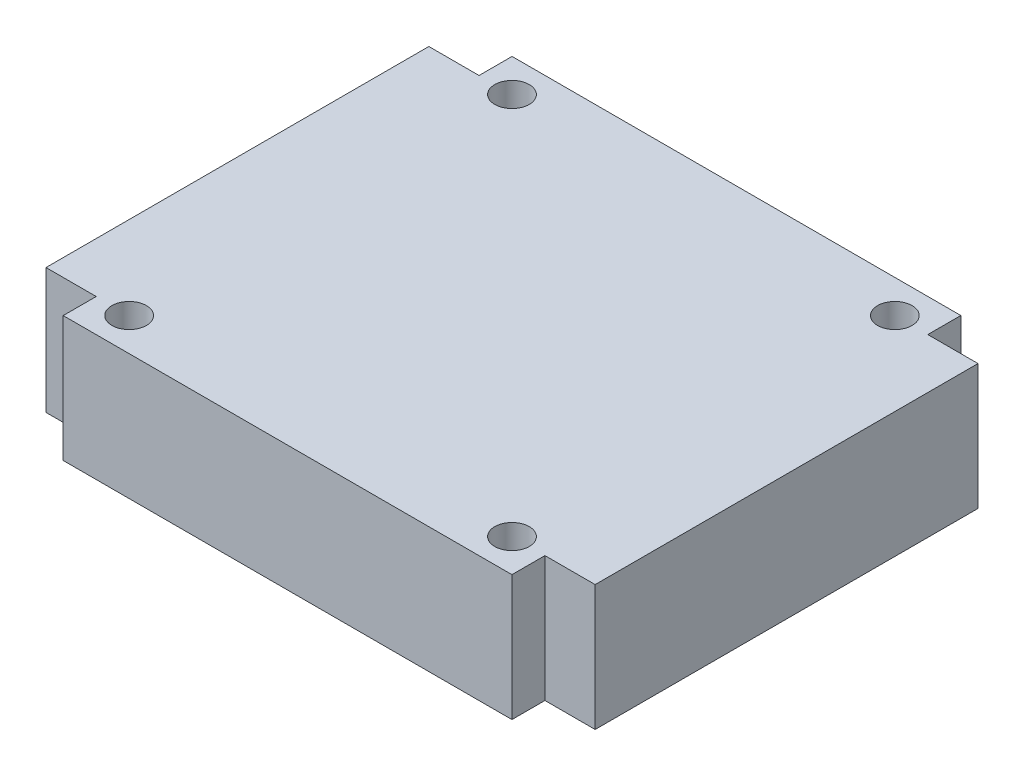
ISO-10303-21;
HEADER;
FILE_DESCRIPTION(('STEP AP214'),'2;1');
FILE_NAME('part.step','',(''),(''),'','','');
FILE_SCHEMA(('AUTOMOTIVE_DESIGN { 1 0 10303 214 1 1 1 1 }'));
ENDSEC;
DATA;
#1=APPLICATION_CONTEXT('core data for automotive mechanical design processes');
#2=APPLICATION_PROTOCOL_DEFINITION('international standard','automotive_design',2000,#1);
#3=PRODUCT_CONTEXT('',#1,'mechanical');
#4=PRODUCT('Part','Part','',(#3));
#5=PRODUCT_RELATED_PRODUCT_CATEGORY('part','',(#4));
#6=PRODUCT_DEFINITION_FORMATION('','',#4);
#7=PRODUCT_DEFINITION_CONTEXT('part definition',#1,'design');
#8=PRODUCT_DEFINITION('design','',#6,#7);
#9=PRODUCT_DEFINITION_SHAPE('','',#8);
#10=(LENGTH_UNIT() NAMED_UNIT(*) SI_UNIT(.MILLI.,.METRE.));
#11=(NAMED_UNIT(*) PLANE_ANGLE_UNIT() SI_UNIT($,.RADIAN.));
#12=(NAMED_UNIT(*) SI_UNIT($,.STERADIAN.) SOLID_ANGLE_UNIT());
#13=UNCERTAINTY_MEASURE_WITH_UNIT(LENGTH_MEASURE(1.E-05),#10,'distance_accuracy_value','');
#14=(GEOMETRIC_REPRESENTATION_CONTEXT(3) GLOBAL_UNCERTAINTY_ASSIGNED_CONTEXT((#13)) GLOBAL_UNIT_ASSIGNED_CONTEXT((#10,
#11,#12)) REPRESENTATION_CONTEXT('',''));
#15=CARTESIAN_POINT('',(0.,0.,0.));
#16=DIRECTION('',(0.,0.,1.));
#17=DIRECTION('',(1.,0.,0.));
#18=AXIS2_PLACEMENT_3D('',#15,#16,#17);
#19=CARTESIAN_POINT('',(21.875,10.,-15.25));
#20=DIRECTION('',(-1.,0.,0.));
#21=DIRECTION('',(0.,0.,1.));
#22=AXIS2_PLACEMENT_3D('',#19,#20,#21);
#23=PLANE('',#22);
#24=DIRECTION('',(0.,0.,-1.));
#25=VECTOR('',#24,1.);
#26=CARTESIAN_POINT('',(21.875,0.,-15.25));
#27=LINE('',#26,#25);
#28=CARTESIAN_POINT('',(21.875,0.,15.25));
#29=VERTEX_POINT('',#28);
#30=CARTESIAN_POINT('',(21.875,0.,-15.25));
#31=VERTEX_POINT('',#30);
#32=EDGE_CURVE('E165',#29,#31,#27,.T.);
#33=ORIENTED_EDGE('',*,*,#32,.T.);
#34=DIRECTION('',(0.,-1.,0.));
#35=VECTOR('',#34,1.);
#36=CARTESIAN_POINT('',(21.875,10.,-15.25));
#37=LINE('',#36,#35);
#38=CARTESIAN_POINT('',(21.875,10.,-15.25));
#39=VERTEX_POINT('',#38);
#40=EDGE_CURVE('E11',#39,#31,#37,.T.);
#41=ORIENTED_EDGE('',*,*,#40,.F.);
#42=DIRECTION('',(0.,0.,-1.));
#43=VECTOR('',#42,1.);
#44=CARTESIAN_POINT('',(21.875,10.,-15.25));
#45=LINE('',#44,#43);
#46=CARTESIAN_POINT('',(21.875,10.,15.25));
#47=VERTEX_POINT('',#46);
#48=EDGE_CURVE('E187',#47,#39,#45,.T.);
#49=ORIENTED_EDGE('',*,*,#48,.F.);
#50=DIRECTION('',(0.,-1.,0.));
#51=VECTOR('',#50,1.);
#52=CARTESIAN_POINT('',(21.875,10.,15.25));
#53=LINE('',#52,#51);
#54=EDGE_CURVE('E161',#47,#29,#53,.T.);
#55=ORIENTED_EDGE('',*,*,#54,.T.);
#56=EDGE_LOOP('',(#33,#41,#49,#55));
#57=FACE_BOUND('',#56,.T.);
#58=ADVANCED_FACE('F43',(#57),#23,.F.);
#59=CARTESIAN_POINT('',(17.875,10.,-15.25));
#60=DIRECTION('',(0.,0.,1.));
#61=DIRECTION('',(1.,0.,0.));
#62=AXIS2_PLACEMENT_3D('',#59,#60,#61);
#63=PLANE('',#62);
#64=DIRECTION('',(-1.,0.,0.));
#65=VECTOR('',#64,1.);
#66=CARTESIAN_POINT('',(17.875,0.,-15.25));
#67=LINE('',#66,#65);
#68=CARTESIAN_POINT('',(17.875,0.,-15.25));
#69=VERTEX_POINT('',#68);
#70=EDGE_CURVE('E168',#31,#69,#67,.T.);
#71=ORIENTED_EDGE('',*,*,#70,.T.);
#72=DIRECTION('',(0.,-1.,0.));
#73=VECTOR('',#72,1.);
#74=CARTESIAN_POINT('',(17.875,10.,-15.25));
#75=LINE('',#74,#73);
#76=CARTESIAN_POINT('',(17.875,10.,-15.25));
#77=VERTEX_POINT('',#76);
#78=EDGE_CURVE('E52',#77,#69,#75,.T.);
#79=ORIENTED_EDGE('',*,*,#78,.F.);
#80=DIRECTION('',(-1.,0.,0.));
#81=VECTOR('',#80,1.);
#82=CARTESIAN_POINT('',(17.875,10.,-15.25));
#83=LINE('',#82,#81);
#84=EDGE_CURVE('E116',#39,#77,#83,.T.);
#85=ORIENTED_EDGE('',*,*,#84,.F.);
#86=ORIENTED_EDGE('',*,*,#40,.T.);
#87=EDGE_LOOP('',(#71,#79,#85,#86));
#88=FACE_BOUND('',#87,.T.);
#89=ADVANCED_FACE('F252',(#88),#63,.F.);
#90=CARTESIAN_POINT('',(17.875,10.,-15.25));
#91=DIRECTION('',(-1.,0.,0.));
#92=DIRECTION('',(0.,0.,1.));
#93=AXIS2_PLACEMENT_3D('',#90,#91,#92);
#94=PLANE('',#93);
#95=DIRECTION('',(0.,0.,-1.));
#96=VECTOR('',#95,1.);
#97=CARTESIAN_POINT('',(17.875,0.,-15.25));
#98=LINE('',#97,#96);
#99=CARTESIAN_POINT('',(17.875,0.,-17.88));
#100=VERTEX_POINT('',#99);
#101=EDGE_CURVE('E170',#69,#100,#98,.T.);
#102=ORIENTED_EDGE('',*,*,#101,.T.);
#103=DIRECTION('',(0.,-1.,0.));
#104=VECTOR('',#103,1.);
#105=CARTESIAN_POINT('',(17.875,10.,-17.88));
#106=LINE('',#105,#104);
#107=CARTESIAN_POINT('',(17.875,10.,-17.88));
#108=VERTEX_POINT('',#107);
#109=EDGE_CURVE('E206',#108,#100,#106,.T.);
#110=ORIENTED_EDGE('',*,*,#109,.F.);
#111=DIRECTION('',(0.,0.,-1.));
#112=VECTOR('',#111,1.);
#113=CARTESIAN_POINT('',(17.875,10.,-15.25));
#114=LINE('',#113,#112);
#115=EDGE_CURVE('E369',#77,#108,#114,.T.);
#116=ORIENTED_EDGE('',*,*,#115,.F.);
#117=ORIENTED_EDGE('',*,*,#78,.T.);
#118=EDGE_LOOP('',(#102,#110,#116,#117));
#119=FACE_BOUND('',#118,.T.);
#120=ADVANCED_FACE('F256',(#119),#94,.F.);
#121=CARTESIAN_POINT('',(-17.875,10.,-17.88));
#122=DIRECTION('',(0.,0.,1.));
#123=DIRECTION('',(1.,0.,0.));
#124=AXIS2_PLACEMENT_3D('',#121,#122,#123);
#125=PLANE('',#124);
#126=DIRECTION('',(-1.,0.,0.));
#127=VECTOR('',#126,1.);
#128=CARTESIAN_POINT('',(-17.875,0.,-17.88));
#129=LINE('',#128,#127);
#130=CARTESIAN_POINT('',(-17.875,0.,-17.88));
#131=VERTEX_POINT('',#130);
#132=EDGE_CURVE('E172',#100,#131,#129,.T.);
#133=ORIENTED_EDGE('',*,*,#132,.T.);
#134=DIRECTION('',(0.,-1.,0.));
#135=VECTOR('',#134,1.);
#136=CARTESIAN_POINT('',(-17.875,10.,-17.88));
#137=LINE('',#136,#135);
#138=CARTESIAN_POINT('',(-17.875,10.,-17.88));
#139=VERTEX_POINT('',#138);
#140=EDGE_CURVE('E203',#139,#131,#137,.T.);
#141=ORIENTED_EDGE('',*,*,#140,.F.);
#142=DIRECTION('',(-1.,0.,0.));
#143=VECTOR('',#142,1.);
#144=CARTESIAN_POINT('',(-17.875,10.,-17.88));
#145=LINE('',#144,#143);
#146=EDGE_CURVE('E371',#108,#139,#145,.T.);
#147=ORIENTED_EDGE('',*,*,#146,.F.);
#148=ORIENTED_EDGE('',*,*,#109,.T.);
#149=EDGE_LOOP('',(#133,#141,#147,#148));
#150=FACE_BOUND('',#149,.T.);
#151=ADVANCED_FACE('F260',(#150),#125,.F.);
#152=CARTESIAN_POINT('',(-17.875,10.,-15.25));
#153=DIRECTION('',(1.,0.,0.));
#154=DIRECTION('',(0.,0.,-1.));
#155=AXIS2_PLACEMENT_3D('',#152,#153,#154);
#156=PLANE('',#155);
#157=DIRECTION('',(0.,0.,1.));
#158=VECTOR('',#157,1.);
#159=CARTESIAN_POINT('',(-17.875,0.,-15.25));
#160=LINE('',#159,#158);
#161=CARTESIAN_POINT('',(-17.875,0.,-15.25));
#162=VERTEX_POINT('',#161);
#163=EDGE_CURVE('E174',#131,#162,#160,.T.);
#164=ORIENTED_EDGE('',*,*,#163,.T.);
#165=DIRECTION('',(0.,-1.,0.));
#166=VECTOR('',#165,1.);
#167=CARTESIAN_POINT('',(-17.875,10.,-15.25));
#168=LINE('',#167,#166);
#169=CARTESIAN_POINT('',(-17.875,10.,-15.25));
#170=VERTEX_POINT('',#169);
#171=EDGE_CURVE('E200',#170,#162,#168,.T.);
#172=ORIENTED_EDGE('',*,*,#171,.F.);
#173=DIRECTION('',(0.,0.,1.));
#174=VECTOR('',#173,1.);
#175=CARTESIAN_POINT('',(-17.875,10.,-15.25));
#176=LINE('',#175,#174);
#177=EDGE_CURVE('E373',#139,#170,#176,.T.);
#178=ORIENTED_EDGE('',*,*,#177,.F.);
#179=ORIENTED_EDGE('',*,*,#140,.T.);
#180=EDGE_LOOP('',(#164,#172,#178,#179));
#181=FACE_BOUND('',#180,.T.);
#182=ADVANCED_FACE('F266',(#181),#156,.F.);
#183=CARTESIAN_POINT('',(-17.875,10.,-15.25));
#184=DIRECTION('',(0.,0.,1.));
#185=DIRECTION('',(1.,0.,0.));
#186=AXIS2_PLACEMENT_3D('',#183,#184,#185);
#187=PLANE('',#186);
#188=DIRECTION('',(-1.,0.,0.));
#189=VECTOR('',#188,1.);
#190=CARTESIAN_POINT('',(-17.875,0.,-15.25));
#191=LINE('',#190,#189);
#192=CARTESIAN_POINT('',(-21.875,0.,-15.25));
#193=VERTEX_POINT('',#192);
#194=EDGE_CURVE('E176',#162,#193,#191,.T.);
#195=ORIENTED_EDGE('',*,*,#194,.T.);
#196=DIRECTION('',(0.,-1.,0.));
#197=VECTOR('',#196,1.);
#198=CARTESIAN_POINT('',(-21.875,10.,-15.25));
#199=LINE('',#198,#197);
#200=CARTESIAN_POINT('',(-21.875,10.,-15.25));
#201=VERTEX_POINT('',#200);
#202=EDGE_CURVE('E197',#201,#193,#199,.T.);
#203=ORIENTED_EDGE('',*,*,#202,.F.);
#204=DIRECTION('',(-1.,0.,0.));
#205=VECTOR('',#204,1.);
#206=CARTESIAN_POINT('',(-17.875,10.,-15.25));
#207=LINE('',#206,#205);
#208=EDGE_CURVE('E375',#170,#201,#207,.T.);
#209=ORIENTED_EDGE('',*,*,#208,.F.);
#210=ORIENTED_EDGE('',*,*,#171,.T.);
#211=EDGE_LOOP('',(#195,#203,#209,#210));
#212=FACE_BOUND('',#211,.T.);
#213=ADVANCED_FACE('F270',(#212),#187,.F.);
#214=CARTESIAN_POINT('',(-21.875,10.,-15.25));
#215=DIRECTION('',(1.,0.,0.));
#216=DIRECTION('',(0.,0.,-1.));
#217=AXIS2_PLACEMENT_3D('',#214,#215,#216);
#218=PLANE('',#217);
#219=DIRECTION('',(0.,0.,1.));
#220=VECTOR('',#219,1.);
#221=CARTESIAN_POINT('',(-21.875,0.,-15.25));
#222=LINE('',#221,#220);
#223=CARTESIAN_POINT('',(-21.875,0.,15.25));
#224=VERTEX_POINT('',#223);
#225=EDGE_CURVE('E178',#193,#224,#222,.T.);
#226=ORIENTED_EDGE('',*,*,#225,.T.);
#227=DIRECTION('',(0.,-1.,0.));
#228=VECTOR('',#227,1.);
#229=CARTESIAN_POINT('',(-21.875,10.,15.25));
#230=LINE('',#229,#228);
#231=CARTESIAN_POINT('',(-21.875,10.,15.25));
#232=VERTEX_POINT('',#231);
#233=EDGE_CURVE('E194',#232,#224,#230,.T.);
#234=ORIENTED_EDGE('',*,*,#233,.F.);
#235=DIRECTION('',(0.,0.,1.));
#236=VECTOR('',#235,1.);
#237=CARTESIAN_POINT('',(-21.875,10.,-15.25));
#238=LINE('',#237,#236);
#239=EDGE_CURVE('E377',#201,#232,#238,.T.);
#240=ORIENTED_EDGE('',*,*,#239,.F.);
#241=ORIENTED_EDGE('',*,*,#202,.T.);
#242=EDGE_LOOP('',(#226,#234,#240,#241));
#243=FACE_BOUND('',#242,.T.);
#244=ADVANCED_FACE('F274',(#243),#218,.F.);
#245=CARTESIAN_POINT('',(-17.875,10.,15.25));
#246=DIRECTION('',(0.,0.,-1.));
#247=DIRECTION('',(-1.,0.,0.));
#248=AXIS2_PLACEMENT_3D('',#245,#246,#247);
#249=PLANE('',#248);
#250=DIRECTION('',(1.,0.,0.));
#251=VECTOR('',#250,1.);
#252=CARTESIAN_POINT('',(-17.875,0.,15.25));
#253=LINE('',#252,#251);
#254=CARTESIAN_POINT('',(-17.875,0.,15.25));
#255=VERTEX_POINT('',#254);
#256=EDGE_CURVE('E180',#224,#255,#253,.T.);
#257=ORIENTED_EDGE('',*,*,#256,.T.);
#258=DIRECTION('',(0.,-1.,0.));
#259=VECTOR('',#258,1.);
#260=CARTESIAN_POINT('',(-17.875,10.,15.25));
#261=LINE('',#260,#259);
#262=CARTESIAN_POINT('',(-17.875,10.,15.25));
#263=VERTEX_POINT('',#262);
#264=EDGE_CURVE('E191',#263,#255,#261,.T.);
#265=ORIENTED_EDGE('',*,*,#264,.F.);
#266=DIRECTION('',(1.,0.,0.));
#267=VECTOR('',#266,1.);
#268=CARTESIAN_POINT('',(-17.875,10.,15.25));
#269=LINE('',#268,#267);
#270=EDGE_CURVE('E379',#232,#263,#269,.T.);
#271=ORIENTED_EDGE('',*,*,#270,.F.);
#272=ORIENTED_EDGE('',*,*,#233,.T.);
#273=EDGE_LOOP('',(#257,#265,#271,#272));
#274=FACE_BOUND('',#273,.T.);
#275=ADVANCED_FACE('F278',(#274),#249,.F.);
#276=CARTESIAN_POINT('',(-17.875,10.,17.88));
#277=DIRECTION('',(1.,0.,0.));
#278=DIRECTION('',(0.,0.,-1.));
#279=AXIS2_PLACEMENT_3D('',#276,#277,#278);
#280=PLANE('',#279);
#281=DIRECTION('',(0.,0.,1.));
#282=VECTOR('',#281,1.);
#283=CARTESIAN_POINT('',(-17.875,0.,17.88));
#284=LINE('',#283,#282);
#285=CARTESIAN_POINT('',(-17.875,0.,17.88));
#286=VERTEX_POINT('',#285);
#287=EDGE_CURVE('E182',#255,#286,#284,.T.);
#288=ORIENTED_EDGE('',*,*,#287,.T.);
#289=DIRECTION('',(0.,-1.,0.));
#290=VECTOR('',#289,1.);
#291=CARTESIAN_POINT('',(-17.875,10.,17.88));
#292=LINE('',#291,#290);
#293=CARTESIAN_POINT('',(-17.875,10.,17.88));
#294=VERTEX_POINT('',#293);
#295=EDGE_CURVE('E156',#294,#286,#292,.T.);
#296=ORIENTED_EDGE('',*,*,#295,.F.);
#297=DIRECTION('',(0.,0.,1.));
#298=VECTOR('',#297,1.);
#299=CARTESIAN_POINT('',(-17.875,10.,17.88));
#300=LINE('',#299,#298);
#301=EDGE_CURVE('E147',#263,#294,#300,.T.);
#302=ORIENTED_EDGE('',*,*,#301,.F.);
#303=ORIENTED_EDGE('',*,*,#264,.T.);
#304=EDGE_LOOP('',(#288,#296,#302,#303));
#305=FACE_BOUND('',#304,.T.);
#306=ADVANCED_FACE('F282',(#305),#280,.F.);
#307=CARTESIAN_POINT('',(-17.875,10.,17.88));
#308=DIRECTION('',(0.,0.,-1.));
#309=DIRECTION('',(-1.,0.,0.));
#310=AXIS2_PLACEMENT_3D('',#307,#308,#309);
#311=PLANE('',#310);
#312=DIRECTION('',(1.,0.,0.));
#313=VECTOR('',#312,1.);
#314=CARTESIAN_POINT('',(-17.875,0.,17.88));
#315=LINE('',#314,#313);
#316=CARTESIAN_POINT('',(17.875,0.,17.88));
#317=VERTEX_POINT('',#316);
#318=EDGE_CURVE('E155',#286,#317,#315,.T.);
#319=ORIENTED_EDGE('',*,*,#318,.T.);
#320=DIRECTION('',(0.,-1.,0.));
#321=VECTOR('',#320,1.);
#322=CARTESIAN_POINT('',(17.875,10.,17.88));
#323=LINE('',#322,#321);
#324=CARTESIAN_POINT('',(17.875,10.,17.88));
#325=VERTEX_POINT('',#324);
#326=EDGE_CURVE('E152',#325,#317,#323,.T.);
#327=ORIENTED_EDGE('',*,*,#326,.F.);
#328=DIRECTION('',(1.,0.,0.));
#329=VECTOR('',#328,1.);
#330=CARTESIAN_POINT('',(-17.875,10.,17.88));
#331=LINE('',#330,#329);
#332=EDGE_CURVE('E141',#294,#325,#331,.T.);
#333=ORIENTED_EDGE('',*,*,#332,.F.);
#334=ORIENTED_EDGE('',*,*,#295,.T.);
#335=EDGE_LOOP('',(#319,#327,#333,#334));
#336=FACE_BOUND('',#335,.T.);
#337=ADVANCED_FACE('F153',(#336),#311,.F.);
#338=CARTESIAN_POINT('',(17.875,10.,17.88));
#339=DIRECTION('',(-1.,0.,0.));
#340=DIRECTION('',(0.,0.,1.));
#341=AXIS2_PLACEMENT_3D('',#338,#339,#340);
#342=PLANE('',#341);
#343=DIRECTION('',(0.,0.,-1.));
#344=VECTOR('',#343,1.);
#345=CARTESIAN_POINT('',(17.875,0.,17.88));
#346=LINE('',#345,#344);
#347=CARTESIAN_POINT('',(17.875,0.,15.25));
#348=VERTEX_POINT('',#347);
#349=EDGE_CURVE('E102',#317,#348,#346,.T.);
#350=ORIENTED_EDGE('',*,*,#349,.T.);
#351=DIRECTION('',(0.,-1.,0.));
#352=VECTOR('',#351,1.);
#353=CARTESIAN_POINT('',(17.875,10.,15.25));
#354=LINE('',#353,#352);
#355=CARTESIAN_POINT('',(17.875,10.,15.25));
#356=VERTEX_POINT('',#355);
#357=EDGE_CURVE('E157',#356,#348,#354,.T.);
#358=ORIENTED_EDGE('',*,*,#357,.F.);
#359=DIRECTION('',(0.,0.,-1.));
#360=VECTOR('',#359,1.);
#361=CARTESIAN_POINT('',(17.875,10.,17.88));
#362=LINE('',#361,#360);
#363=EDGE_CURVE('E145',#325,#356,#362,.T.);
#364=ORIENTED_EDGE('',*,*,#363,.F.);
#365=ORIENTED_EDGE('',*,*,#326,.T.);
#366=EDGE_LOOP('',(#350,#358,#364,#365));
#367=FACE_BOUND('',#366,.T.);
#368=ADVANCED_FACE('F159',(#367),#342,.F.);
#369=CARTESIAN_POINT('',(17.875,10.,15.25));
#370=DIRECTION('',(0.,0.,-1.));
#371=DIRECTION('',(-1.,0.,0.));
#372=AXIS2_PLACEMENT_3D('',#369,#370,#371);
#373=PLANE('',#372);
#374=DIRECTION('',(1.,0.,0.));
#375=VECTOR('',#374,1.);
#376=CARTESIAN_POINT('',(17.875,0.,15.25));
#377=LINE('',#376,#375);
#378=EDGE_CURVE('E108',#348,#29,#377,.T.);
#379=ORIENTED_EDGE('',*,*,#378,.T.);
#380=ORIENTED_EDGE('',*,*,#54,.F.);
#381=DIRECTION('',(1.,0.,0.));
#382=VECTOR('',#381,1.);
#383=CARTESIAN_POINT('',(17.875,10.,15.25));
#384=LINE('',#383,#382);
#385=EDGE_CURVE('E61',#356,#47,#384,.T.);
#386=ORIENTED_EDGE('',*,*,#385,.F.);
#387=ORIENTED_EDGE('',*,*,#357,.T.);
#388=EDGE_LOOP('',(#379,#380,#386,#387));
#389=FACE_BOUND('',#388,.T.);
#390=ADVANCED_FACE('F241',(#389),#373,.F.);
#391=CARTESIAN_POINT('',(0.,10.,0.));
#392=DIRECTION('',(0.,1.,0.));
#393=DIRECTION('',(0.,0.,1.));
#394=AXIS2_PLACEMENT_3D('',#391,#392,#393);
#395=PLANE('',#394);
#396=CARTESIAN_POINT('',(-15.25,10.,15.25));
#397=DIRECTION('',(0.,1.,0.));
#398=DIRECTION('',(0.,0.,1.));
#399=AXIS2_PLACEMENT_3D('',#396,#397,#398);
#400=CIRCLE('',#399,1.375);
#401=CARTESIAN_POINT('',(-15.25,10.,16.625));
#402=VERTEX_POINT('',#401);
#403=EDGE_CURVE('E357',#402,#402,#400,.T.);
#404=ORIENTED_EDGE('',*,*,#403,.F.);
#405=EDGE_LOOP('',(#404));
#406=FACE_BOUND('',#405,.T.);
#407=CARTESIAN_POINT('',(15.25,10.,15.25));
#408=DIRECTION('',(0.,1.,0.));
#409=DIRECTION('',(0.,0.,1.));
#410=AXIS2_PLACEMENT_3D('',#407,#408,#409);
#411=CIRCLE('',#410,1.375);
#412=CARTESIAN_POINT('',(15.25,10.,16.625));
#413=VERTEX_POINT('',#412);
#414=EDGE_CURVE('E358',#413,#413,#411,.T.);
#415=ORIENTED_EDGE('',*,*,#414,.F.);
#416=EDGE_LOOP('',(#415));
#417=FACE_BOUND('',#416,.T.);
#418=CARTESIAN_POINT('',(15.25,10.,-15.25));
#419=DIRECTION('',(0.,1.,0.));
#420=DIRECTION('',(0.,0.,1.));
#421=AXIS2_PLACEMENT_3D('',#418,#419,#420);
#422=CIRCLE('',#421,1.375);
#423=CARTESIAN_POINT('',(15.25,10.,-13.875));
#424=VERTEX_POINT('',#423);
#425=EDGE_CURVE('E361',#424,#424,#422,.T.);
#426=ORIENTED_EDGE('',*,*,#425,.F.);
#427=EDGE_LOOP('',(#426));
#428=FACE_BOUND('',#427,.T.);
#429=CARTESIAN_POINT('',(-15.25,10.,-15.25));
#430=DIRECTION('',(0.,1.,0.));
#431=DIRECTION('',(0.,0.,1.));
#432=AXIS2_PLACEMENT_3D('',#429,#430,#431);
#433=CIRCLE('',#432,1.375);
#434=CARTESIAN_POINT('',(-15.25,10.,-13.875));
#435=VERTEX_POINT('',#434);
#436=EDGE_CURVE('E215',#435,#435,#433,.T.);
#437=ORIENTED_EDGE('',*,*,#436,.F.);
#438=EDGE_LOOP('',(#437));
#439=FACE_BOUND('',#438,.T.);
#440=ORIENTED_EDGE('',*,*,#48,.T.);
#441=ORIENTED_EDGE('',*,*,#84,.T.);
#442=ORIENTED_EDGE('',*,*,#115,.T.);
#443=ORIENTED_EDGE('',*,*,#146,.T.);
#444=ORIENTED_EDGE('',*,*,#177,.T.);
#445=ORIENTED_EDGE('',*,*,#208,.T.);
#446=ORIENTED_EDGE('',*,*,#239,.T.);
#447=ORIENTED_EDGE('',*,*,#270,.T.);
#448=ORIENTED_EDGE('',*,*,#301,.T.);
#449=ORIENTED_EDGE('',*,*,#332,.T.);
#450=ORIENTED_EDGE('',*,*,#363,.T.);
#451=ORIENTED_EDGE('',*,*,#385,.T.);
#452=EDGE_LOOP('',(#440,#441,#442,#443,#444,#445,#446,#447,#448,#449,#450,#451));
#453=FACE_BOUND('',#452,.T.);
#454=ADVANCED_FACE('F143',(#406,#417,#428,#439,#453),#395,.T.);
#455=CARTESIAN_POINT('',(0.,0.,0.));
#456=DIRECTION('',(0.,1.,0.));
#457=DIRECTION('',(0.,0.,1.));
#458=AXIS2_PLACEMENT_3D('',#455,#456,#457);
#459=PLANE('',#458);
#460=CARTESIAN_POINT('',(-15.25,0.,15.25));
#461=DIRECTION('',(0.,1.,0.));
#462=DIRECTION('',(0.,0.,1.));
#463=AXIS2_PLACEMENT_3D('',#460,#461,#462);
#464=CIRCLE('',#463,1.375);
#465=CARTESIAN_POINT('',(-15.25,0.,16.625));
#466=VERTEX_POINT('',#465);
#467=EDGE_CURVE('E46',#466,#466,#464,.F.);
#468=ORIENTED_EDGE('',*,*,#467,.F.);
#469=EDGE_LOOP('',(#468));
#470=FACE_BOUND('',#469,.T.);
#471=CARTESIAN_POINT('',(15.25,0.,15.25));
#472=DIRECTION('',(0.,1.,0.));
#473=DIRECTION('',(0.,0.,1.));
#474=AXIS2_PLACEMENT_3D('',#471,#472,#473);
#475=CIRCLE('',#474,1.375);
#476=CARTESIAN_POINT('',(15.25,0.,16.625));
#477=VERTEX_POINT('',#476);
#478=EDGE_CURVE('E217',#477,#477,#475,.F.);
#479=ORIENTED_EDGE('',*,*,#478,.F.);
#480=EDGE_LOOP('',(#479));
#481=FACE_BOUND('',#480,.T.);
#482=CARTESIAN_POINT('',(15.25,0.,-15.25));
#483=DIRECTION('',(0.,1.,0.));
#484=DIRECTION('',(0.,0.,1.));
#485=AXIS2_PLACEMENT_3D('',#482,#483,#484);
#486=CIRCLE('',#485,1.375);
#487=CARTESIAN_POINT('',(15.25,0.,-13.875));
#488=VERTEX_POINT('',#487);
#489=EDGE_CURVE('E214',#488,#488,#486,.F.);
#490=ORIENTED_EDGE('',*,*,#489,.F.);
#491=EDGE_LOOP('',(#490));
#492=FACE_BOUND('',#491,.T.);
#493=CARTESIAN_POINT('',(-15.25,0.,-15.25));
#494=DIRECTION('',(0.,1.,0.));
#495=DIRECTION('',(0.,0.,1.));
#496=AXIS2_PLACEMENT_3D('',#493,#494,#495);
#497=CIRCLE('',#496,1.375);
#498=CARTESIAN_POINT('',(-15.25,0.,-13.875));
#499=VERTEX_POINT('',#498);
#500=EDGE_CURVE('E211',#499,#499,#497,.F.);
#501=ORIENTED_EDGE('',*,*,#500,.F.);
#502=EDGE_LOOP('',(#501));
#503=FACE_BOUND('',#502,.T.);
#504=ORIENTED_EDGE('',*,*,#32,.F.);
#505=ORIENTED_EDGE('',*,*,#378,.F.);
#506=ORIENTED_EDGE('',*,*,#349,.F.);
#507=ORIENTED_EDGE('',*,*,#318,.F.);
#508=ORIENTED_EDGE('',*,*,#287,.F.);
#509=ORIENTED_EDGE('',*,*,#256,.F.);
#510=ORIENTED_EDGE('',*,*,#225,.F.);
#511=ORIENTED_EDGE('',*,*,#194,.F.);
#512=ORIENTED_EDGE('',*,*,#163,.F.);
#513=ORIENTED_EDGE('',*,*,#132,.F.);
#514=ORIENTED_EDGE('',*,*,#101,.F.);
#515=ORIENTED_EDGE('',*,*,#70,.F.);
#516=EDGE_LOOP('',(#504,#505,#506,#507,#508,#509,#510,#511,#512,#513,#514,#515));
#517=FACE_BOUND('',#516,.T.);
#518=ADVANCED_FACE('F226',(#470,#481,#492,#503,#517),#459,.F.);
#519=CARTESIAN_POINT('',(-15.25,10.,-15.25));
#520=DIRECTION('',(0.,-1.,0.));
#521=DIRECTION('',(0.,0.,-1.));
#522=AXIS2_PLACEMENT_3D('',#519,#520,#521);
#523=CYLINDRICAL_SURFACE('',#522,1.375);
#524=ORIENTED_EDGE('',*,*,#436,.T.);
#525=EDGE_LOOP('',(#524));
#526=FACE_BOUND('',#525,.T.);
#527=ORIENTED_EDGE('',*,*,#500,.T.);
#528=EDGE_LOOP('',(#527));
#529=FACE_BOUND('',#528,.T.);
#530=ADVANCED_FACE('F229',(#526,#529),#523,.F.);
#531=CARTESIAN_POINT('',(15.25,10.,-15.25));
#532=DIRECTION('',(0.,-1.,0.));
#533=DIRECTION('',(0.,0.,-1.));
#534=AXIS2_PLACEMENT_3D('',#531,#532,#533);
#535=CYLINDRICAL_SURFACE('',#534,1.375);
#536=ORIENTED_EDGE('',*,*,#425,.T.);
#537=EDGE_LOOP('',(#536));
#538=FACE_BOUND('',#537,.T.);
#539=ORIENTED_EDGE('',*,*,#489,.T.);
#540=EDGE_LOOP('',(#539));
#541=FACE_BOUND('',#540,.T.);
#542=ADVANCED_FACE('F323',(#538,#541),#535,.F.);
#543=CARTESIAN_POINT('',(15.25,10.,15.25));
#544=DIRECTION('',(0.,-1.,0.));
#545=DIRECTION('',(0.,0.,-1.));
#546=AXIS2_PLACEMENT_3D('',#543,#544,#545);
#547=CYLINDRICAL_SURFACE('',#546,1.375);
#548=ORIENTED_EDGE('',*,*,#414,.T.);
#549=EDGE_LOOP('',(#548));
#550=FACE_BOUND('',#549,.T.);
#551=ORIENTED_EDGE('',*,*,#478,.T.);
#552=EDGE_LOOP('',(#551));
#553=FACE_BOUND('',#552,.T.);
#554=ADVANCED_FACE('F333',(#550,#553),#547,.F.);
#555=CARTESIAN_POINT('',(-15.25,10.,15.25));
#556=DIRECTION('',(0.,-1.,0.));
#557=DIRECTION('',(0.,0.,-1.));
#558=AXIS2_PLACEMENT_3D('',#555,#556,#557);
#559=CYLINDRICAL_SURFACE('',#558,1.375);
#560=ORIENTED_EDGE('',*,*,#403,.T.);
#561=EDGE_LOOP('',(#560));
#562=FACE_BOUND('',#561,.T.);
#563=ORIENTED_EDGE('',*,*,#467,.T.);
#564=EDGE_LOOP('',(#563));
#565=FACE_BOUND('',#564,.T.);
#566=ADVANCED_FACE('F224',(#562,#565),#559,.F.);
#567=CLOSED_SHELL('',(#58,#89,#120,#151,#182,#213,#244,#275,#306,#337,#368,#390,#454,#518,#530,
#542,#554,#566));
#568=MANIFOLD_SOLID_BREP('B2',#567);
#569=ADVANCED_BREP_SHAPE_REPRESENTATION('',(#18,#568),#14);
#570=SHAPE_DEFINITION_REPRESENTATION(#9,#569);
ENDSEC;
END-ISO-10303-21;
